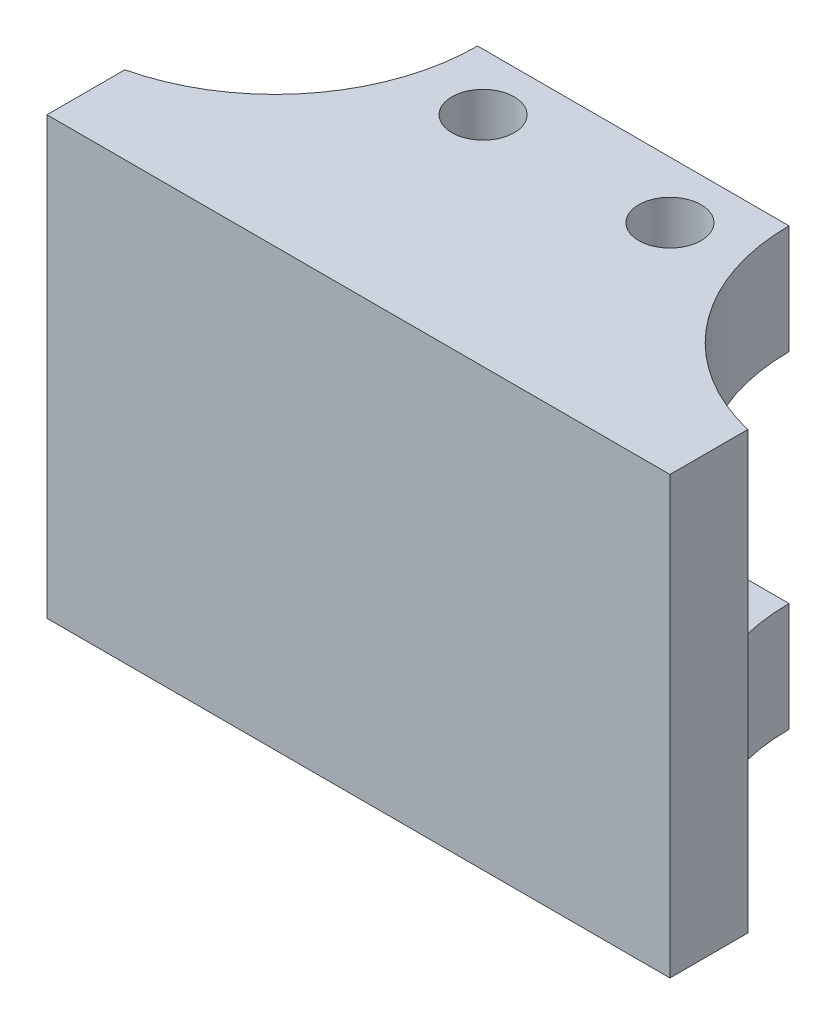
ISO-10303-21;
HEADER;
FILE_DESCRIPTION(('STEP AP214'),'2;1');
FILE_NAME('part.step','',(''),(''),'','','');
FILE_SCHEMA(('AUTOMOTIVE_DESIGN { 1 0 10303 214 1 1 1 1 }'));
ENDSEC;
DATA;
#1=APPLICATION_CONTEXT('core data for automotive mechanical design processes');
#2=APPLICATION_PROTOCOL_DEFINITION('international standard','automotive_design',2000,#1);
#3=PRODUCT_CONTEXT('',#1,'mechanical');
#4=PRODUCT('Part','Part','',(#3));
#5=PRODUCT_RELATED_PRODUCT_CATEGORY('part','',(#4));
#6=PRODUCT_DEFINITION_FORMATION('','',#4);
#7=PRODUCT_DEFINITION_CONTEXT('part definition',#1,'design');
#8=PRODUCT_DEFINITION('design','',#6,#7);
#9=PRODUCT_DEFINITION_SHAPE('','',#8);
#10=(LENGTH_UNIT() NAMED_UNIT(*) SI_UNIT(.MILLI.,.METRE.));
#11=(NAMED_UNIT(*) PLANE_ANGLE_UNIT() SI_UNIT($,.RADIAN.));
#12=(NAMED_UNIT(*) SI_UNIT($,.STERADIAN.) SOLID_ANGLE_UNIT());
#13=UNCERTAINTY_MEASURE_WITH_UNIT(LENGTH_MEASURE(1.E-05),#10,'distance_accuracy_value','');
#14=(GEOMETRIC_REPRESENTATION_CONTEXT(3) GLOBAL_UNCERTAINTY_ASSIGNED_CONTEXT((#13)) GLOBAL_UNIT_ASSIGNED_CONTEXT((#10,
#11,#12)) REPRESENTATION_CONTEXT('',''));
#15=CARTESIAN_POINT('',(0.,0.,0.));
#16=DIRECTION('',(0.,0.,1.));
#17=DIRECTION('',(1.,0.,0.));
#18=AXIS2_PLACEMENT_3D('',#15,#16,#17);
#19=CARTESIAN_POINT('',(-229.97357483485,-140.,-126.470213753951));
#20=DIRECTION('',(0.,1.,0.));
#21=DIRECTION('',(0.,0.,1.));
#22=AXIS2_PLACEMENT_3D('',#19,#20,#21);
#23=CYLINDRICAL_SURFACE('',#22,129.97357483485);
#24=DIRECTION('',(0.,1.,0.));
#25=VECTOR('',#24,1.);
#26=CARTESIAN_POINT('',(-100.,-140.,-126.470213753951));
#27=LINE('',#26,#25);
#28=CARTESIAN_POINT('',(-100.,70.,-126.470213753951));
#29=VERTEX_POINT('',#28);
#30=CARTESIAN_POINT('',(-100.,140.,-126.470213753951));
#31=VERTEX_POINT('',#30);
#32=EDGE_CURVE('E229',#29,#31,#27,.T.);
#33=ORIENTED_EDGE('',*,*,#32,.F.);
#34=CARTESIAN_POINT('',(-229.97357483485,70.,-126.470213753951));
#35=DIRECTION('',(0.,-1.,0.));
#36=DIRECTION('',(0.,0.,-1.));
#37=AXIS2_PLACEMENT_3D('',#34,#35,#36);
#38=CIRCLE('',#37,129.97357483485);
#39=CARTESIAN_POINT('',(-200.,70.,0.));
#40=VERTEX_POINT('',#39);
#41=EDGE_CURVE('E201',#29,#40,#38,.T.);
#42=ORIENTED_EDGE('',*,*,#41,.T.);
#43=DIRECTION('',(0.,-1.,0.));
#44=VECTOR('',#43,1.);
#45=CARTESIAN_POINT('',(-200.,140.,0.));
#46=LINE('',#45,#44);
#47=CARTESIAN_POINT('',(-200.,140.,0.));
#48=VERTEX_POINT('',#47);
#49=EDGE_CURVE('E127',#48,#40,#46,.T.);
#50=ORIENTED_EDGE('',*,*,#49,.F.);
#51=CARTESIAN_POINT('',(-229.97357483485,140.,-126.470213753951));
#52=DIRECTION('',(0.,-1.,0.));
#53=DIRECTION('',(0.,0.,1.));
#54=AXIS2_PLACEMENT_3D('',#51,#52,#53);
#55=CIRCLE('',#54,129.97357483485);
#56=EDGE_CURVE('E205',#31,#48,#55,.T.);
#57=ORIENTED_EDGE('',*,*,#56,.F.);
#58=EDGE_LOOP('',(#33,#42,#50,#57));
#59=FACE_BOUND('',#58,.T.);
#60=ADVANCED_FACE('F39',(#59),#23,.F.);
#61=CARTESIAN_POINT('',(-200.,-70.,0.));
#62=VERTEX_POINT('',#61);
#63=CARTESIAN_POINT('',(-200.,-140.,0.));
#64=VERTEX_POINT('',#63);
#65=EDGE_CURVE('E132',#62,#64,#46,.T.);
#66=ORIENTED_EDGE('',*,*,#65,.F.);
#67=CARTESIAN_POINT('',(-229.97357483485,-70.,-126.470213753951));
#68=DIRECTION('',(0.,1.,0.));
#69=DIRECTION('',(0.,0.,1.));
#70=AXIS2_PLACEMENT_3D('',#67,#68,#69);
#71=CIRCLE('',#70,129.97357483485);
#72=CARTESIAN_POINT('',(-100.,-70.,-126.470213753951));
#73=VERTEX_POINT('',#72);
#74=EDGE_CURVE('E198',#62,#73,#71,.T.);
#75=ORIENTED_EDGE('',*,*,#74,.T.);
#76=CARTESIAN_POINT('',(-100.,-140.,-126.470213753951));
#77=VERTEX_POINT('',#76);
#78=EDGE_CURVE('E90',#77,#73,#27,.T.);
#79=ORIENTED_EDGE('',*,*,#78,.F.);
#80=CARTESIAN_POINT('',(-229.97357483485,-140.,-126.470213753951));
#81=DIRECTION('',(0.,-1.,0.));
#82=DIRECTION('',(0.,0.,1.));
#83=AXIS2_PLACEMENT_3D('',#80,#81,#82);
#84=CIRCLE('',#83,129.97357483485);
#85=EDGE_CURVE('E217',#77,#64,#84,.T.);
#86=ORIENTED_EDGE('',*,*,#85,.T.);
#87=EDGE_LOOP('',(#66,#75,#79,#86));
#88=FACE_BOUND('',#87,.T.);
#89=ADVANCED_FACE('F271',(#88),#23,.F.);
#90=CARTESIAN_POINT('',(-100.,-140.,-126.470213753951));
#91=DIRECTION('',(0.,0.,-1.));
#92=DIRECTION('',(-1.,0.,0.));
#93=AXIS2_PLACEMENT_3D('',#90,#91,#92);
#94=PLANE('',#93);
#95=DIRECTION('',(0.,1.,0.));
#96=VECTOR('',#95,1.);
#97=CARTESIAN_POINT('',(100.,-140.,-126.470213753951));
#98=LINE('',#97,#96);
#99=CARTESIAN_POINT('',(100.,70.,-126.470213753951));
#100=VERTEX_POINT('',#99);
#101=CARTESIAN_POINT('',(100.,140.,-126.470213753951));
#102=VERTEX_POINT('',#101);
#103=EDGE_CURVE('E226',#100,#102,#98,.T.);
#104=ORIENTED_EDGE('',*,*,#103,.F.);
#105=DIRECTION('',(-1.,0.,0.));
#106=VECTOR('',#105,1.);
#107=CARTESIAN_POINT('',(200.,70.,-126.470213753951));
#108=LINE('',#107,#106);
#109=EDGE_CURVE('E194',#100,#29,#108,.T.);
#110=ORIENTED_EDGE('',*,*,#109,.T.);
#111=ORIENTED_EDGE('',*,*,#32,.T.);
#112=DIRECTION('',(-1.,0.,0.));
#113=VECTOR('',#112,1.);
#114=CARTESIAN_POINT('',(-100.,140.,-126.470213753951));
#115=LINE('',#114,#113);
#116=EDGE_CURVE('E213',#102,#31,#115,.T.);
#117=ORIENTED_EDGE('',*,*,#116,.F.);
#118=EDGE_LOOP('',(#104,#110,#111,#117));
#119=FACE_BOUND('',#118,.T.);
#120=ADVANCED_FACE('F277',(#119),#94,.T.);
#121=ORIENTED_EDGE('',*,*,#78,.T.);
#122=DIRECTION('',(-1.,0.,0.));
#123=VECTOR('',#122,1.);
#124=CARTESIAN_POINT('',(200.,-70.,-126.470213753951));
#125=LINE('',#124,#123);
#126=CARTESIAN_POINT('',(100.,-70.,-126.470213753951));
#127=VERTEX_POINT('',#126);
#128=EDGE_CURVE('E184',#127,#73,#125,.T.);
#129=ORIENTED_EDGE('',*,*,#128,.F.);
#130=CARTESIAN_POINT('',(100.,-140.,-126.470213753951));
#131=VERTEX_POINT('',#130);
#132=EDGE_CURVE('E230',#131,#127,#98,.T.);
#133=ORIENTED_EDGE('',*,*,#132,.F.);
#134=DIRECTION('',(-1.,0.,0.));
#135=VECTOR('',#134,1.);
#136=CARTESIAN_POINT('',(-100.,-140.,-126.470213753951));
#137=LINE('',#136,#135);
#138=EDGE_CURVE('E222',#131,#77,#137,.T.);
#139=ORIENTED_EDGE('',*,*,#138,.T.);
#140=EDGE_LOOP('',(#121,#129,#133,#139));
#141=FACE_BOUND('',#140,.T.);
#142=ADVANCED_FACE('F375',(#141),#94,.T.);
#143=CARTESIAN_POINT('',(229.97357483485,-140.,-126.470213753951));
#144=DIRECTION('',(0.,1.,0.));
#145=DIRECTION('',(0.,0.,1.));
#146=AXIS2_PLACEMENT_3D('',#143,#144,#145);
#147=CYLINDRICAL_SURFACE('',#146,129.97357483485);
#148=DIRECTION('',(0.,1.,0.));
#149=VECTOR('',#148,1.);
#150=CARTESIAN_POINT('',(200.,140.,0.));
#151=LINE('',#150,#149);
#152=CARTESIAN_POINT('',(200.,70.,0.));
#153=VERTEX_POINT('',#152);
#154=CARTESIAN_POINT('',(200.,140.,0.));
#155=VERTEX_POINT('',#154);
#156=EDGE_CURVE('E131',#153,#155,#151,.T.);
#157=ORIENTED_EDGE('',*,*,#156,.F.);
#158=CARTESIAN_POINT('',(229.97357483485,70.,-126.470213753951));
#159=DIRECTION('',(0.,-1.,0.));
#160=DIRECTION('',(0.,0.,-1.));
#161=AXIS2_PLACEMENT_3D('',#158,#159,#160);
#162=CIRCLE('',#161,129.97357483485);
#163=EDGE_CURVE('E11',#153,#100,#162,.T.);
#164=ORIENTED_EDGE('',*,*,#163,.T.);
#165=ORIENTED_EDGE('',*,*,#103,.T.);
#166=CARTESIAN_POINT('',(229.97357483485,140.,-126.470213753951));
#167=DIRECTION('',(0.,-1.,0.));
#168=DIRECTION('',(0.,0.,-1.));
#169=AXIS2_PLACEMENT_3D('',#166,#167,#168);
#170=CIRCLE('',#169,129.97357483485);
#171=EDGE_CURVE('E209',#155,#102,#170,.T.);
#172=ORIENTED_EDGE('',*,*,#171,.F.);
#173=EDGE_LOOP('',(#157,#164,#165,#172));
#174=FACE_BOUND('',#173,.T.);
#175=ADVANCED_FACE('F281',(#174),#147,.F.);
#176=ORIENTED_EDGE('',*,*,#132,.T.);
#177=CARTESIAN_POINT('',(229.97357483485,-70.,-126.470213753951));
#178=DIRECTION('',(0.,1.,0.));
#179=DIRECTION('',(0.,0.,1.));
#180=AXIS2_PLACEMENT_3D('',#177,#178,#179);
#181=CIRCLE('',#180,129.97357483485);
#182=CARTESIAN_POINT('',(200.,-70.,0.));
#183=VERTEX_POINT('',#182);
#184=EDGE_CURVE('E49',#127,#183,#181,.T.);
#185=ORIENTED_EDGE('',*,*,#184,.T.);
#186=CARTESIAN_POINT('',(200.,-140.,0.));
#187=VERTEX_POINT('',#186);
#188=EDGE_CURVE('E133',#187,#183,#151,.T.);
#189=ORIENTED_EDGE('',*,*,#188,.F.);
#190=CARTESIAN_POINT('',(229.97357483485,-140.,-126.470213753951));
#191=DIRECTION('',(0.,-1.,0.));
#192=DIRECTION('',(0.,0.,-1.));
#193=AXIS2_PLACEMENT_3D('',#190,#191,#192);
#194=CIRCLE('',#193,129.97357483485);
#195=EDGE_CURVE('E79',#187,#131,#194,.T.);
#196=ORIENTED_EDGE('',*,*,#195,.T.);
#197=EDGE_LOOP('',(#176,#185,#189,#196));
#198=FACE_BOUND('',#197,.T.);
#199=ADVANCED_FACE('F380',(#198),#147,.F.);
#200=CARTESIAN_POINT('',(-200.,140.,50.));
#201=DIRECTION('',(1.,0.,0.));
#202=DIRECTION('',(0.,1.,0.));
#203=AXIS2_PLACEMENT_3D('',#200,#201,#202);
#204=PLANE('',#203);
#205=ORIENTED_EDGE('',*,*,#49,.T.);
#206=DIRECTION('',(0.,-1.,0.));
#207=VECTOR('',#206,1.);
#208=CARTESIAN_POINT('',(-200.,70.,0.));
#209=LINE('',#208,#207);
#210=EDGE_CURVE('E177',#40,#62,#209,.T.);
#211=ORIENTED_EDGE('',*,*,#210,.T.);
#212=ORIENTED_EDGE('',*,*,#65,.T.);
#213=DIRECTION('',(0.,0.,-1.));
#214=VECTOR('',#213,1.);
#215=CARTESIAN_POINT('',(-200.,-140.,50.));
#216=LINE('',#215,#214);
#217=CARTESIAN_POINT('',(-200.,-140.,50.));
#218=VERTEX_POINT('',#217);
#219=EDGE_CURVE('E114',#218,#64,#216,.T.);
#220=ORIENTED_EDGE('',*,*,#219,.F.);
#221=DIRECTION('',(0.,-1.,0.));
#222=VECTOR('',#221,1.);
#223=CARTESIAN_POINT('',(-200.,140.,50.));
#224=LINE('',#223,#222);
#225=CARTESIAN_POINT('',(-200.,140.,50.));
#226=VERTEX_POINT('',#225);
#227=EDGE_CURVE('E103',#226,#218,#224,.T.);
#228=ORIENTED_EDGE('',*,*,#227,.F.);
#229=DIRECTION('',(0.,0.,-1.));
#230=VECTOR('',#229,1.);
#231=CARTESIAN_POINT('',(-200.,140.,50.));
#232=LINE('',#231,#230);
#233=EDGE_CURVE('E123',#226,#48,#232,.T.);
#234=ORIENTED_EDGE('',*,*,#233,.T.);
#235=EDGE_LOOP('',(#205,#211,#212,#220,#228,#234));
#236=FACE_BOUND('',#235,.T.);
#237=ADVANCED_FACE('F41',(#236),#204,.F.);
#238=CARTESIAN_POINT('',(-200.,-140.,50.));
#239=DIRECTION('',(0.,1.,0.));
#240=DIRECTION('',(0.,0.,1.));
#241=AXIS2_PLACEMENT_3D('',#238,#239,#240);
#242=PLANE('',#241);
#243=CARTESIAN_POINT('',(-60.,-140.,-90.));
#244=DIRECTION('',(0.,1.,0.));
#245=DIRECTION('',(0.,0.,1.));
#246=AXIS2_PLACEMENT_3D('',#243,#244,#245);
#247=CIRCLE('',#246,20.);
#248=CARTESIAN_POINT('',(-60.,-140.,-70.));
#249=VERTEX_POINT('',#248);
#250=EDGE_CURVE('E173',#249,#249,#247,.F.);
#251=ORIENTED_EDGE('',*,*,#250,.F.);
#252=EDGE_LOOP('',(#251));
#253=FACE_BOUND('',#252,.T.);
#254=CARTESIAN_POINT('',(60.,-140.,-90.));
#255=DIRECTION('',(0.,1.,0.));
#256=DIRECTION('',(0.,0.,1.));
#257=AXIS2_PLACEMENT_3D('',#254,#255,#256);
#258=CIRCLE('',#257,20.);
#259=CARTESIAN_POINT('',(60.,-140.,-70.));
#260=VERTEX_POINT('',#259);
#261=EDGE_CURVE('E159',#260,#260,#258,.F.);
#262=ORIENTED_EDGE('',*,*,#261,.F.);
#263=EDGE_LOOP('',(#262));
#264=FACE_BOUND('',#263,.T.);
#265=ORIENTED_EDGE('',*,*,#219,.T.);
#266=ORIENTED_EDGE('',*,*,#85,.F.);
#267=ORIENTED_EDGE('',*,*,#138,.F.);
#268=ORIENTED_EDGE('',*,*,#195,.F.);
#269=DIRECTION('',(0.,0.,-1.));
#270=VECTOR('',#269,1.);
#271=CARTESIAN_POINT('',(200.,-140.,50.));
#272=LINE('',#271,#270);
#273=CARTESIAN_POINT('',(200.,-140.,50.));
#274=VERTEX_POINT('',#273);
#275=EDGE_CURVE('E109',#274,#187,#272,.T.);
#276=ORIENTED_EDGE('',*,*,#275,.F.);
#277=DIRECTION('',(1.,0.,0.));
#278=VECTOR('',#277,1.);
#279=CARTESIAN_POINT('',(-200.,-140.,50.));
#280=LINE('',#279,#278);
#281=EDGE_CURVE('E97',#218,#274,#280,.T.);
#282=ORIENTED_EDGE('',*,*,#281,.F.);
#283=EDGE_LOOP('',(#265,#266,#267,#268,#276,#282));
#284=FACE_BOUND('',#283,.T.);
#285=ADVANCED_FACE('F110',(#253,#264,#284),#242,.F.);
#286=CARTESIAN_POINT('',(200.,140.,50.));
#287=DIRECTION('',(-1.,0.,0.));
#288=DIRECTION('',(0.,-1.,0.));
#289=AXIS2_PLACEMENT_3D('',#286,#287,#288);
#290=PLANE('',#289);
#291=ORIENTED_EDGE('',*,*,#188,.T.);
#292=DIRECTION('',(0.,-1.,0.));
#293=VECTOR('',#292,1.);
#294=CARTESIAN_POINT('',(200.,70.,0.));
#295=LINE('',#294,#293);
#296=EDGE_CURVE('E181',#153,#183,#295,.T.);
#297=ORIENTED_EDGE('',*,*,#296,.F.);
#298=ORIENTED_EDGE('',*,*,#156,.T.);
#299=DIRECTION('',(0.,0.,-1.));
#300=VECTOR('',#299,1.);
#301=CARTESIAN_POINT('',(200.,140.,50.));
#302=LINE('',#301,#300);
#303=CARTESIAN_POINT('',(200.,140.,50.));
#304=VERTEX_POINT('',#303);
#305=EDGE_CURVE('E115',#304,#155,#302,.T.);
#306=ORIENTED_EDGE('',*,*,#305,.F.);
#307=DIRECTION('',(0.,1.,0.));
#308=VECTOR('',#307,1.);
#309=CARTESIAN_POINT('',(200.,140.,50.));
#310=LINE('',#309,#308);
#311=EDGE_CURVE('E100',#274,#304,#310,.T.);
#312=ORIENTED_EDGE('',*,*,#311,.F.);
#313=ORIENTED_EDGE('',*,*,#275,.T.);
#314=EDGE_LOOP('',(#291,#297,#298,#306,#312,#313));
#315=FACE_BOUND('',#314,.T.);
#316=ADVANCED_FACE('F117',(#315),#290,.F.);
#317=CARTESIAN_POINT('',(-200.,140.,50.));
#318=DIRECTION('',(0.,-1.,0.));
#319=DIRECTION('',(0.,0.,-1.));
#320=AXIS2_PLACEMENT_3D('',#317,#318,#319);
#321=PLANE('',#320);
#322=CARTESIAN_POINT('',(-60.,140.,-90.));
#323=DIRECTION('',(0.,-1.,0.));
#324=DIRECTION('',(0.,0.,-1.));
#325=AXIS2_PLACEMENT_3D('',#322,#323,#324);
#326=CIRCLE('',#325,20.);
#327=CARTESIAN_POINT('',(-60.,140.,-110.));
#328=VERTEX_POINT('',#327);
#329=EDGE_CURVE('E169',#328,#328,#326,.F.);
#330=ORIENTED_EDGE('',*,*,#329,.F.);
#331=EDGE_LOOP('',(#330));
#332=FACE_BOUND('',#331,.T.);
#333=CARTESIAN_POINT('',(60.,140.,-90.));
#334=DIRECTION('',(0.,-1.,0.));
#335=DIRECTION('',(0.,0.,-1.));
#336=AXIS2_PLACEMENT_3D('',#333,#334,#335);
#337=CIRCLE('',#336,20.);
#338=CARTESIAN_POINT('',(60.,140.,-110.));
#339=VERTEX_POINT('',#338);
#340=EDGE_CURVE('E153',#339,#339,#337,.F.);
#341=ORIENTED_EDGE('',*,*,#340,.F.);
#342=EDGE_LOOP('',(#341));
#343=FACE_BOUND('',#342,.T.);
#344=ORIENTED_EDGE('',*,*,#305,.T.);
#345=ORIENTED_EDGE('',*,*,#171,.T.);
#346=ORIENTED_EDGE('',*,*,#116,.T.);
#347=ORIENTED_EDGE('',*,*,#56,.T.);
#348=ORIENTED_EDGE('',*,*,#233,.F.);
#349=DIRECTION('',(-1.,0.,0.));
#350=VECTOR('',#349,1.);
#351=CARTESIAN_POINT('',(-200.,140.,50.));
#352=LINE('',#351,#350);
#353=EDGE_CURVE('E66',#304,#226,#352,.T.);
#354=ORIENTED_EDGE('',*,*,#353,.F.);
#355=EDGE_LOOP('',(#344,#345,#346,#347,#348,#354));
#356=FACE_BOUND('',#355,.T.);
#357=ADVANCED_FACE('F286',(#332,#343,#356),#321,.F.);
#358=CARTESIAN_POINT('',(0.,0.,50.));
#359=DIRECTION('',(0.,0.,1.));
#360=DIRECTION('',(1.,0.,0.));
#361=AXIS2_PLACEMENT_3D('',#358,#359,#360);
#362=PLANE('',#361);
#363=ORIENTED_EDGE('',*,*,#227,.T.);
#364=ORIENTED_EDGE('',*,*,#281,.T.);
#365=ORIENTED_EDGE('',*,*,#311,.T.);
#366=ORIENTED_EDGE('',*,*,#353,.T.);
#367=EDGE_LOOP('',(#363,#364,#365,#366));
#368=FACE_BOUND('',#367,.T.);
#369=ADVANCED_FACE('F98',(#368),#362,.T.);
#370=CARTESIAN_POINT('',(200.,70.,-126.470213753951));
#371=DIRECTION('',(0.,-1.,0.));
#372=DIRECTION('',(0.,0.,-1.));
#373=AXIS2_PLACEMENT_3D('',#370,#371,#372);
#374=PLANE('',#373);
#375=CARTESIAN_POINT('',(-60.,70.,-90.));
#376=DIRECTION('',(0.,-1.,0.));
#377=DIRECTION('',(0.,0.,-1.));
#378=AXIS2_PLACEMENT_3D('',#375,#376,#377);
#379=CIRCLE('',#378,20.);
#380=CARTESIAN_POINT('',(-60.,70.,-110.));
#381=VERTEX_POINT('',#380);
#382=EDGE_CURVE('E165',#381,#381,#379,.F.);
#383=ORIENTED_EDGE('',*,*,#382,.T.);
#384=EDGE_LOOP('',(#383));
#385=FACE_BOUND('',#384,.T.);
#386=CARTESIAN_POINT('',(60.,70.,-90.));
#387=DIRECTION('',(0.,-1.,0.));
#388=DIRECTION('',(0.,0.,-1.));
#389=AXIS2_PLACEMENT_3D('',#386,#387,#388);
#390=CIRCLE('',#389,20.);
#391=CARTESIAN_POINT('',(60.,70.,-110.));
#392=VERTEX_POINT('',#391);
#393=EDGE_CURVE('E148',#392,#392,#390,.F.);
#394=ORIENTED_EDGE('',*,*,#393,.T.);
#395=EDGE_LOOP('',(#394));
#396=FACE_BOUND('',#395,.T.);
#397=ORIENTED_EDGE('',*,*,#109,.F.);
#398=ORIENTED_EDGE('',*,*,#163,.F.);
#399=DIRECTION('',(-1.,0.,0.));
#400=VECTOR('',#399,1.);
#401=CARTESIAN_POINT('',(200.,70.,0.));
#402=LINE('',#401,#400);
#403=EDGE_CURVE('E57',#153,#40,#402,.T.);
#404=ORIENTED_EDGE('',*,*,#403,.T.);
#405=ORIENTED_EDGE('',*,*,#41,.F.);
#406=EDGE_LOOP('',(#397,#398,#404,#405));
#407=FACE_BOUND('',#406,.T.);
#408=ADVANCED_FACE('F285',(#385,#396,#407),#374,.T.);
#409=CARTESIAN_POINT('',(200.,70.,0.));
#410=DIRECTION('',(0.,0.,-1.));
#411=DIRECTION('',(0.,1.,0.));
#412=AXIS2_PLACEMENT_3D('',#409,#410,#411);
#413=PLANE('',#412);
#414=ORIENTED_EDGE('',*,*,#403,.F.);
#415=ORIENTED_EDGE('',*,*,#296,.T.);
#416=DIRECTION('',(-1.,0.,0.));
#417=VECTOR('',#416,1.);
#418=CARTESIAN_POINT('',(200.,-70.,0.));
#419=LINE('',#418,#417);
#420=EDGE_CURVE('E188',#183,#62,#419,.T.);
#421=ORIENTED_EDGE('',*,*,#420,.T.);
#422=ORIENTED_EDGE('',*,*,#210,.F.);
#423=EDGE_LOOP('',(#414,#415,#421,#422));
#424=FACE_BOUND('',#423,.T.);
#425=ADVANCED_FACE('F266',(#424),#413,.T.);
#426=CARTESIAN_POINT('',(200.,-70.,-126.470213753951));
#427=DIRECTION('',(0.,1.,0.));
#428=DIRECTION('',(0.,0.,1.));
#429=AXIS2_PLACEMENT_3D('',#426,#427,#428);
#430=PLANE('',#429);
#431=CARTESIAN_POINT('',(-60.,-70.,-90.));
#432=DIRECTION('',(0.,1.,0.));
#433=DIRECTION('',(0.,0.,1.));
#434=AXIS2_PLACEMENT_3D('',#431,#432,#433);
#435=CIRCLE('',#434,20.);
#436=CARTESIAN_POINT('',(-60.,-70.,-70.));
#437=VERTEX_POINT('',#436);
#438=EDGE_CURVE('E43',#437,#437,#435,.F.);
#439=ORIENTED_EDGE('',*,*,#438,.T.);
#440=EDGE_LOOP('',(#439));
#441=FACE_BOUND('',#440,.T.);
#442=CARTESIAN_POINT('',(60.,-70.,-90.));
#443=DIRECTION('',(0.,1.,0.));
#444=DIRECTION('',(0.,0.,1.));
#445=AXIS2_PLACEMENT_3D('',#442,#443,#444);
#446=CIRCLE('',#445,20.);
#447=CARTESIAN_POINT('',(60.,-70.,-70.));
#448=VERTEX_POINT('',#447);
#449=EDGE_CURVE('E145',#448,#448,#446,.F.);
#450=ORIENTED_EDGE('',*,*,#449,.T.);
#451=EDGE_LOOP('',(#450));
#452=FACE_BOUND('',#451,.T.);
#453=ORIENTED_EDGE('',*,*,#420,.F.);
#454=ORIENTED_EDGE('',*,*,#184,.F.);
#455=ORIENTED_EDGE('',*,*,#128,.T.);
#456=ORIENTED_EDGE('',*,*,#74,.F.);
#457=EDGE_LOOP('',(#453,#454,#455,#456));
#458=FACE_BOUND('',#457,.T.);
#459=ADVANCED_FACE('F245',(#441,#452,#458),#430,.T.);
#460=CARTESIAN_POINT('',(60.,200.,-90.));
#461=DIRECTION('',(0.,-1.,0.));
#462=DIRECTION('',(0.,0.,-1.));
#463=AXIS2_PLACEMENT_3D('',#460,#461,#462);
#464=CYLINDRICAL_SURFACE('',#463,20.);
#465=ORIENTED_EDGE('',*,*,#449,.F.);
#466=EDGE_LOOP('',(#465));
#467=FACE_BOUND('',#466,.T.);
#468=ORIENTED_EDGE('',*,*,#261,.T.);
#469=EDGE_LOOP('',(#468));
#470=FACE_BOUND('',#469,.T.);
#471=ADVANCED_FACE('F251',(#467,#470),#464,.F.);
#472=CARTESIAN_POINT('',(-60.,200.,-90.));
#473=DIRECTION('',(0.,-1.,0.));
#474=DIRECTION('',(0.,0.,-1.));
#475=AXIS2_PLACEMENT_3D('',#472,#473,#474);
#476=CYLINDRICAL_SURFACE('',#475,20.);
#477=ORIENTED_EDGE('',*,*,#438,.F.);
#478=EDGE_LOOP('',(#477));
#479=FACE_BOUND('',#478,.T.);
#480=ORIENTED_EDGE('',*,*,#250,.T.);
#481=EDGE_LOOP('',(#480));
#482=FACE_BOUND('',#481,.T.);
#483=ADVANCED_FACE('F247',(#479,#482),#476,.F.);
#484=ORIENTED_EDGE('',*,*,#393,.F.);
#485=EDGE_LOOP('',(#484));
#486=FACE_BOUND('',#485,.T.);
#487=ORIENTED_EDGE('',*,*,#340,.T.);
#488=EDGE_LOOP('',(#487));
#489=FACE_BOUND('',#488,.T.);
#490=ADVANCED_FACE('F250',(#486,#489),#464,.F.);
#491=ORIENTED_EDGE('',*,*,#382,.F.);
#492=EDGE_LOOP('',(#491));
#493=FACE_BOUND('',#492,.T.);
#494=ORIENTED_EDGE('',*,*,#329,.T.);
#495=EDGE_LOOP('',(#494));
#496=FACE_BOUND('',#495,.T.);
#497=ADVANCED_FACE('F253',(#493,#496),#476,.F.);
#498=CLOSED_SHELL('',(#60,#89,#120,#142,#175,#199,#237,#285,#316,#357,#369,#408,#425,#459,#471,
#483,#490,#497));
#499=MANIFOLD_SOLID_BREP('B2',#498);
#500=ADVANCED_BREP_SHAPE_REPRESENTATION('',(#18,#499),#14);
#501=SHAPE_DEFINITION_REPRESENTATION(#9,#500);
ENDSEC;
END-ISO-10303-21;
